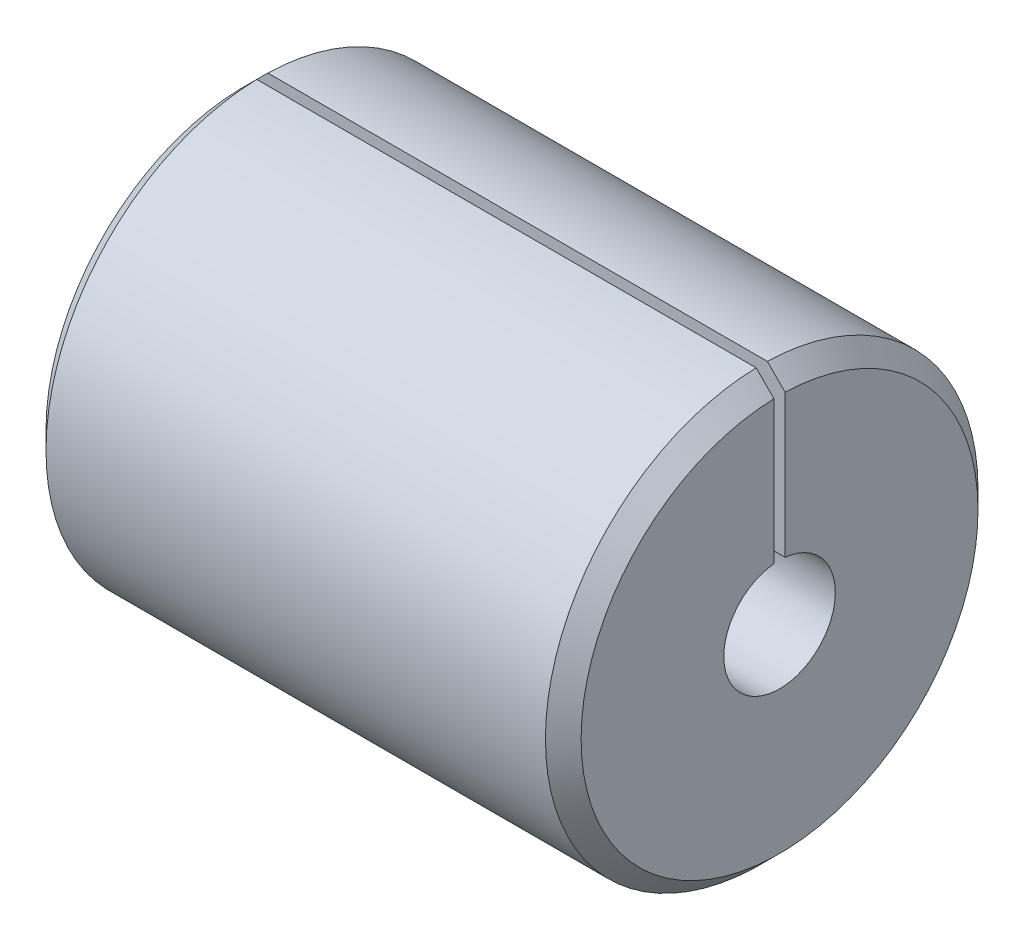
ISO-10303-21;
HEADER;
FILE_DESCRIPTION(('STEP AP214'),'2;1');
FILE_NAME('part.step','',(''),(''),'','','');
FILE_SCHEMA(('AUTOMOTIVE_DESIGN { 1 0 10303 214 1 1 1 1 }'));
ENDSEC;
DATA;
#1=APPLICATION_CONTEXT('core data for automotive mechanical design processes');
#2=APPLICATION_PROTOCOL_DEFINITION('international standard','automotive_design',2000,#1);
#3=PRODUCT_CONTEXT('',#1,'mechanical');
#4=PRODUCT('Part','Part','',(#3));
#5=PRODUCT_RELATED_PRODUCT_CATEGORY('part','',(#4));
#6=PRODUCT_DEFINITION_FORMATION('','',#4);
#7=PRODUCT_DEFINITION_CONTEXT('part definition',#1,'design');
#8=PRODUCT_DEFINITION('design','',#6,#7);
#9=PRODUCT_DEFINITION_SHAPE('','',#8);
#10=(LENGTH_UNIT() NAMED_UNIT(*) SI_UNIT(.MILLI.,.METRE.));
#11=(NAMED_UNIT(*) PLANE_ANGLE_UNIT() SI_UNIT($,.RADIAN.));
#12=(NAMED_UNIT(*) SI_UNIT($,.STERADIAN.) SOLID_ANGLE_UNIT());
#13=UNCERTAINTY_MEASURE_WITH_UNIT(LENGTH_MEASURE(1.E-05),#10,'distance_accuracy_value','');
#14=(GEOMETRIC_REPRESENTATION_CONTEXT(3) GLOBAL_UNCERTAINTY_ASSIGNED_CONTEXT((#13)) GLOBAL_UNIT_ASSIGNED_CONTEXT((#10,
#11,#12)) REPRESENTATION_CONTEXT('',''));
#15=CARTESIAN_POINT('',(0.,0.,0.));
#16=DIRECTION('',(0.,0.,1.));
#17=DIRECTION('',(1.,0.,0.));
#18=AXIS2_PLACEMENT_3D('',#15,#16,#17);
#19=CARTESIAN_POINT('',(24.,0.,0.));
#20=DIRECTION('',(-1.,0.,0.));
#21=DIRECTION('',(0.,0.,1.));
#22=AXIS2_PLACEMENT_3D('',#19,#20,#21);
#23=CYLINDRICAL_SURFACE('',#22,9.7);
#24=DIRECTION('',(-1.,0.,0.));
#25=VECTOR('',#24,1.);
#26=CARTESIAN_POINT('',(24.,9.69677781533639,0.249999999999999));
#27=LINE('',#26,#25);
#28=CARTESIAN_POINT('',(23.2,9.69677781533639,0.249999999999999));
#29=VERTEX_POINT('',#28);
#30=CARTESIAN_POINT('',(0.800000000000006,9.69677781533639,0.249999999999999));
#31=VERTEX_POINT('',#30);
#32=EDGE_CURVE('E118',#29,#31,#27,.T.);
#33=ORIENTED_EDGE('',*,*,#32,.T.);
#34=CARTESIAN_POINT('',(0.800000000000006,0.,0.));
#35=DIRECTION('',(1.,0.,0.));
#36=DIRECTION('',(0.,0.,-1.));
#37=AXIS2_PLACEMENT_3D('',#34,#35,#36);
#38=CIRCLE('',#37,9.7);
#39=CARTESIAN_POINT('',(0.800000000000006,9.69677781533639,-0.250000000000002));
#40=VERTEX_POINT('',#39);
#41=EDGE_CURVE('E124',#31,#40,#38,.T.);
#42=ORIENTED_EDGE('',*,*,#41,.T.);
#43=DIRECTION('',(-1.,0.,0.));
#44=VECTOR('',#43,1.);
#45=CARTESIAN_POINT('',(24.,9.69677781533639,-0.250000000000002));
#46=LINE('',#45,#44);
#47=CARTESIAN_POINT('',(23.2,9.69677781533639,-0.250000000000002));
#48=VERTEX_POINT('',#47);
#49=EDGE_CURVE('E186',#40,#48,#46,.F.);
#50=ORIENTED_EDGE('',*,*,#49,.T.);
#51=CARTESIAN_POINT('',(23.2,0.,0.));
#52=DIRECTION('',(1.,0.,0.));
#53=DIRECTION('',(0.,0.,-1.));
#54=AXIS2_PLACEMENT_3D('',#51,#52,#53);
#55=CIRCLE('',#54,9.7);
#56=EDGE_CURVE('E104',#48,#29,#55,.F.);
#57=ORIENTED_EDGE('',*,*,#56,.T.);
#58=EDGE_LOOP('',(#33,#42,#50,#57));
#59=FACE_BOUND('',#58,.T.);
#60=ADVANCED_FACE('F39',(#59),#23,.T.);
#61=CARTESIAN_POINT('',(24.,0.,0.));
#62=DIRECTION('',(1.,0.,0.));
#63=DIRECTION('',(0.,0.,-1.));
#64=AXIS2_PLACEMENT_3D('',#61,#62,#63);
#65=PLANE('',#64);
#66=DIRECTION('',(0.,1.,0.));
#67=VECTOR('',#66,1.);
#68=CARTESIAN_POINT('',(24.,19.3999999999999,0.249999999999996));
#69=LINE('',#68,#67);
#70=CARTESIAN_POINT('',(24.,2.48746859276655,0.250000000000001));
#71=VERTEX_POINT('',#70);
#72=CARTESIAN_POINT('',(24.,8.89648807114358,0.249999999999999));
#73=VERTEX_POINT('',#72);
#74=EDGE_CURVE('E99',#71,#73,#69,.T.);
#75=ORIENTED_EDGE('',*,*,#74,.T.);
#76=CARTESIAN_POINT('',(24.,0.,0.));
#77=DIRECTION('',(1.,0.,0.));
#78=DIRECTION('',(0.,0.,-1.));
#79=AXIS2_PLACEMENT_3D('',#76,#77,#78);
#80=CIRCLE('',#79,8.90000000000001);
#81=CARTESIAN_POINT('',(24.,8.89648807114358,-0.250000000000002));
#82=VERTEX_POINT('',#81);
#83=EDGE_CURVE('E11',#73,#82,#80,.T.);
#84=ORIENTED_EDGE('',*,*,#83,.T.);
#85=DIRECTION('',(0.,-1.,0.));
#86=VECTOR('',#85,1.);
#87=CARTESIAN_POINT('',(24.,19.3999999999999,-0.250000000000004));
#88=LINE('',#87,#86);
#89=CARTESIAN_POINT('',(24.,2.48746859276655,-0.250000000000001));
#90=VERTEX_POINT('',#89);
#91=EDGE_CURVE('E180',#82,#90,#88,.T.);
#92=ORIENTED_EDGE('',*,*,#91,.T.);
#93=CARTESIAN_POINT('',(24.,0.,0.));
#94=DIRECTION('',(1.,0.,0.));
#95=DIRECTION('',(0.,0.,-1.));
#96=AXIS2_PLACEMENT_3D('',#93,#94,#95);
#97=CIRCLE('',#96,2.5);
#98=EDGE_CURVE('E115',#71,#90,#97,.T.);
#99=ORIENTED_EDGE('',*,*,#98,.F.);
#100=EDGE_LOOP('',(#75,#84,#92,#99));
#101=FACE_BOUND('',#100,.T.);
#102=ADVANCED_FACE('F171',(#101),#65,.T.);
#103=CARTESIAN_POINT('',(0.,0.,0.));
#104=DIRECTION('',(1.,0.,0.));
#105=DIRECTION('',(0.,0.,-1.));
#106=AXIS2_PLACEMENT_3D('',#103,#104,#105);
#107=PLANE('',#106);
#108=DIRECTION('',(0.,-1.,0.));
#109=VECTOR('',#108,1.);
#110=CARTESIAN_POINT('',(0.,19.3999999999999,-0.250000000000004));
#111=LINE('',#110,#109);
#112=CARTESIAN_POINT('',(0.,8.89648807114357,-0.250000000000002));
#113=VERTEX_POINT('',#112);
#114=CARTESIAN_POINT('',(0.,2.48746859276655,-0.250000000000001));
#115=VERTEX_POINT('',#114);
#116=EDGE_CURVE('E110',#113,#115,#111,.T.);
#117=ORIENTED_EDGE('',*,*,#116,.F.);
#118=CARTESIAN_POINT('',(0.,0.,0.));
#119=DIRECTION('',(1.,0.,0.));
#120=DIRECTION('',(0.,0.,-1.));
#121=AXIS2_PLACEMENT_3D('',#118,#119,#120);
#122=CIRCLE('',#121,8.89999999999999);
#123=CARTESIAN_POINT('',(0.,8.89648807114357,0.249999999999999));
#124=VERTEX_POINT('',#123);
#125=EDGE_CURVE('E64',#113,#124,#122,.F.);
#126=ORIENTED_EDGE('',*,*,#125,.T.);
#127=DIRECTION('',(0.,1.,0.));
#128=VECTOR('',#127,1.);
#129=CARTESIAN_POINT('',(0.,19.3999999999999,0.249999999999996));
#130=LINE('',#129,#128);
#131=CARTESIAN_POINT('',(0.,2.48746859276655,0.250000000000001));
#132=VERTEX_POINT('',#131);
#133=EDGE_CURVE('E97',#132,#124,#130,.T.);
#134=ORIENTED_EDGE('',*,*,#133,.F.);
#135=CARTESIAN_POINT('',(0.,0.,0.));
#136=DIRECTION('',(1.,0.,0.));
#137=DIRECTION('',(0.,0.,-1.));
#138=AXIS2_PLACEMENT_3D('',#135,#136,#137);
#139=CIRCLE('',#138,2.5);
#140=EDGE_CURVE('E109',#132,#115,#139,.T.);
#141=ORIENTED_EDGE('',*,*,#140,.T.);
#142=EDGE_LOOP('',(#117,#126,#134,#141));
#143=FACE_BOUND('',#142,.T.);
#144=ADVANCED_FACE('F108',(#143),#107,.F.);
#145=CARTESIAN_POINT('',(0.,0.,0.));
#146=DIRECTION('',(1.,0.,0.));
#147=DIRECTION('',(0.,0.,-1.));
#148=AXIS2_PLACEMENT_3D('',#145,#146,#147);
#149=CYLINDRICAL_SURFACE('',#148,2.5);
#150=ORIENTED_EDGE('',*,*,#140,.F.);
#151=DIRECTION('',(1.,0.,0.));
#152=VECTOR('',#151,1.);
#153=CARTESIAN_POINT('',(0.,2.48746859276655,0.250000000000001));
#154=LINE('',#153,#152);
#155=EDGE_CURVE('E95',#132,#71,#154,.T.);
#156=ORIENTED_EDGE('',*,*,#155,.T.);
#157=ORIENTED_EDGE('',*,*,#98,.T.);
#158=DIRECTION('',(1.,0.,0.));
#159=VECTOR('',#158,1.);
#160=CARTESIAN_POINT('',(0.,2.48746859276655,-0.250000000000001));
#161=LINE('',#160,#159);
#162=EDGE_CURVE('E105',#90,#115,#161,.F.);
#163=ORIENTED_EDGE('',*,*,#162,.T.);
#164=EDGE_LOOP('',(#150,#156,#157,#163));
#165=FACE_BOUND('',#164,.T.);
#166=ADVANCED_FACE('F113',(#165),#149,.F.);
#167=CARTESIAN_POINT('',(24.,19.3999999999999,-0.250000000000004));
#168=DIRECTION('',(0.,0.,-1.));
#169=DIRECTION('',(0.,1.,0.));
#170=AXIS2_PLACEMENT_3D('',#167,#168,#169);
#171=PLANE('',#170);
#172=ORIENTED_EDGE('',*,*,#49,.F.);
#173=CARTESIAN_POINT('',(0.800000000000006,9.69677781533639,-0.250000000000002));
#174=CARTESIAN_POINT('',(0.666664588519333,9.5633982686999,-0.250000000000002));
#175=CARTESIAN_POINT('',(0.533330216112504,9.43001768336576,-0.250000000000002));
#176=CARTESIAN_POINT('',(0.266663549445835,9.16325443530149,-0.250000000000002));
#177=CARTESIAN_POINT('',(0.133331255185996,9.02987177257135,-0.250000000000002));
#178=CARTESIAN_POINT('',(0.,8.89648807114357,-0.250000000000002));
#179=B_SPLINE_CURVE_WITH_KNOTS('',3,(#173,#174,#175,#176,#177,#178),.UNSPECIFIED.,.F.,.F.,(4,2,
4),(0.,0.565787874280467,1.13157574856389),.UNSPECIFIED.);
#180=EDGE_CURVE('E134',#40,#113,#179,.T.);
#181=ORIENTED_EDGE('',*,*,#180,.T.);
#182=ORIENTED_EDGE('',*,*,#116,.T.);
#183=ORIENTED_EDGE('',*,*,#162,.F.);
#184=ORIENTED_EDGE('',*,*,#91,.F.);
#185=CARTESIAN_POINT('',(24.,8.89648807114358,-0.250000000000002));
#186=CARTESIAN_POINT('',(23.866668744814,9.02987177257136,-0.250000000000002));
#187=CARTESIAN_POINT('',(23.7333364505542,9.16325443530149,-0.250000000000002));
#188=CARTESIAN_POINT('',(23.4666697838875,9.43001768336576,-0.250000000000002));
#189=CARTESIAN_POINT('',(23.3333354114807,9.5633982686999,-0.250000000000002));
#190=CARTESIAN_POINT('',(23.2,9.69677781533639,-0.250000000000002));
#191=B_SPLINE_CURVE_WITH_KNOTS('',3,(#185,#186,#187,#188,#189,#190),.UNSPECIFIED.,.F.,.F.,(4,2,
4),(0.,0.565787874283412,1.13157574856387),.UNSPECIFIED.);
#192=EDGE_CURVE('E127',#82,#48,#191,.T.);
#193=ORIENTED_EDGE('',*,*,#192,.T.);
#194=EDGE_LOOP('',(#172,#181,#182,#183,#184,#193));
#195=FACE_BOUND('',#194,.T.);
#196=ADVANCED_FACE('F140',(#195),#171,.F.);
#197=CARTESIAN_POINT('',(24.,19.3999999999999,0.249999999999996));
#198=DIRECTION('',(0.,0.,1.));
#199=DIRECTION('',(0.,-1.,0.));
#200=AXIS2_PLACEMENT_3D('',#197,#198,#199);
#201=PLANE('',#200);
#202=ORIENTED_EDGE('',*,*,#133,.T.);
#203=CARTESIAN_POINT('',(0.,8.89648807114357,0.249999999999999));
#204=CARTESIAN_POINT('',(0.133331255185996,9.02987177257135,0.249999999999999));
#205=CARTESIAN_POINT('',(0.266663549445835,9.16325443530149,0.249999999999999));
#206=CARTESIAN_POINT('',(0.533330216112503,9.43001768336576,0.249999999999999));
#207=CARTESIAN_POINT('',(0.666664588519333,9.5633982686999,0.249999999999999));
#208=CARTESIAN_POINT('',(0.800000000000005,9.69677781533639,0.249999999999999));
#209=B_SPLINE_CURVE_WITH_KNOTS('',3,(#203,#204,#205,#206,#207,#208),.UNSPECIFIED.,.F.,.F.,(4,2,
4),(0.,0.565787874283421,1.13157574856389),.UNSPECIFIED.);
#210=EDGE_CURVE('E49',#124,#31,#209,.T.);
#211=ORIENTED_EDGE('',*,*,#210,.T.);
#212=ORIENTED_EDGE('',*,*,#32,.F.);
#213=CARTESIAN_POINT('',(23.2,9.69677781533639,0.249999999999999));
#214=CARTESIAN_POINT('',(23.3333354114807,9.5633982686999,0.249999999999999));
#215=CARTESIAN_POINT('',(23.4666697838875,9.43001768336576,0.249999999999999));
#216=CARTESIAN_POINT('',(23.7333364505542,9.16325443530149,0.249999999999999));
#217=CARTESIAN_POINT('',(23.866668744814,9.02987177257136,0.249999999999999));
#218=CARTESIAN_POINT('',(24.,8.89648807114358,0.249999999999999));
#219=B_SPLINE_CURVE_WITH_KNOTS('',3,(#213,#214,#215,#216,#217,#218),.UNSPECIFIED.,.F.,.F.,(4,2,
4),(0.,0.565787874280459,1.13157574856387),.UNSPECIFIED.);
#220=EDGE_CURVE('E56',#29,#73,#219,.T.);
#221=ORIENTED_EDGE('',*,*,#220,.T.);
#222=ORIENTED_EDGE('',*,*,#74,.F.);
#223=ORIENTED_EDGE('',*,*,#155,.F.);
#224=EDGE_LOOP('',(#202,#211,#212,#221,#222,#223));
#225=FACE_BOUND('',#224,.T.);
#226=ADVANCED_FACE('F96',(#225),#201,.F.);
#227=CARTESIAN_POINT('',(0.800000000000006,0.,0.));
#228=DIRECTION('',(1.,0.,0.));
#229=DIRECTION('',(0.,0.,-1.));
#230=AXIS2_PLACEMENT_3D('',#227,#228,#229);
#231=CONICAL_SURFACE('',#230,9.7,0.785398163397449);
#232=ORIENTED_EDGE('',*,*,#210,.F.);
#233=ORIENTED_EDGE('',*,*,#125,.F.);
#234=ORIENTED_EDGE('',*,*,#180,.F.);
#235=ORIENTED_EDGE('',*,*,#41,.F.);
#236=EDGE_LOOP('',(#232,#233,#234,#235));
#237=FACE_BOUND('',#236,.T.);
#238=ADVANCED_FACE('F149',(#237),#231,.T.);
#239=CARTESIAN_POINT('',(24.,0.,0.));
#240=DIRECTION('',(-1.,0.,0.));
#241=DIRECTION('',(0.,0.,1.));
#242=AXIS2_PLACEMENT_3D('',#239,#240,#241);
#243=CONICAL_SURFACE('',#242,8.90000000000001,0.785398163397447);
#244=ORIENTED_EDGE('',*,*,#220,.F.);
#245=ORIENTED_EDGE('',*,*,#56,.F.);
#246=ORIENTED_EDGE('',*,*,#192,.F.);
#247=ORIENTED_EDGE('',*,*,#83,.F.);
#248=EDGE_LOOP('',(#244,#245,#246,#247));
#249=FACE_BOUND('',#248,.T.);
#250=ADVANCED_FACE('F42',(#249),#243,.T.);
#251=CLOSED_SHELL('',(#60,#102,#144,#166,#196,#226,#238,#250));
#252=MANIFOLD_SOLID_BREP('B2',#251);
#253=ADVANCED_BREP_SHAPE_REPRESENTATION('',(#18,#252),#14);
#254=SHAPE_DEFINITION_REPRESENTATION(#9,#253);
ENDSEC;
END-ISO-10303-21;
